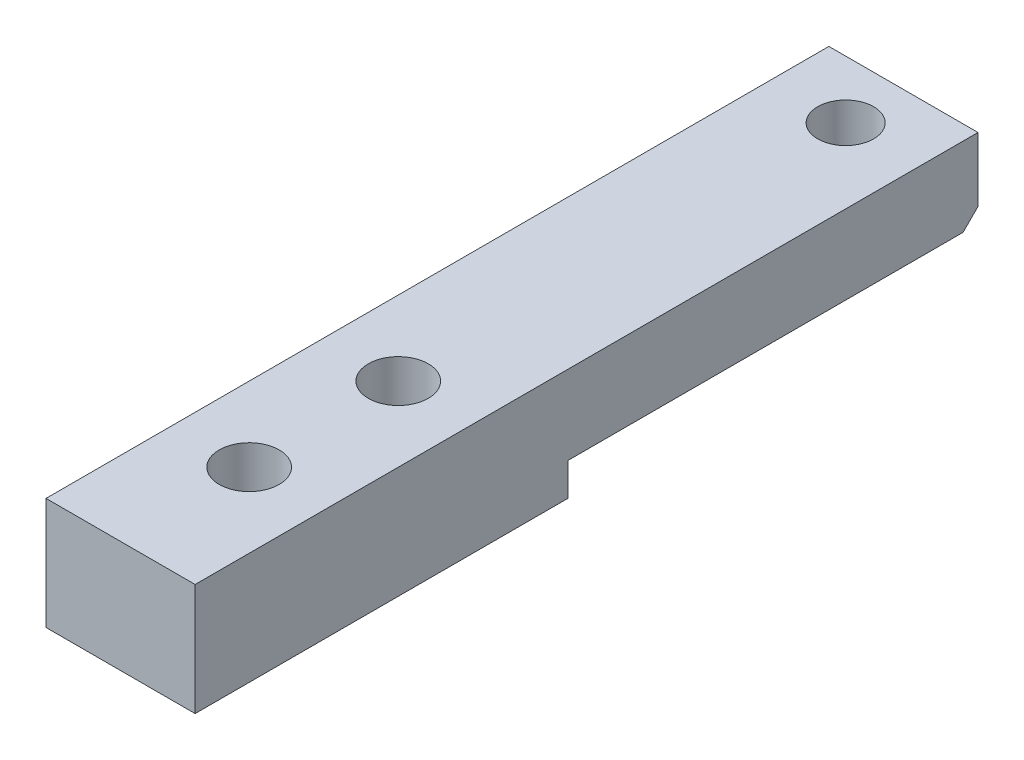
ISO-10303-21;
HEADER;
FILE_DESCRIPTION(('STEP AP214'),'2;1');
FILE_NAME('part.step','',(''),(''),'','','');
FILE_SCHEMA(('AUTOMOTIVE_DESIGN { 1 0 10303 214 1 1 1 1 }'));
ENDSEC;
DATA;
#1=APPLICATION_CONTEXT('core data for automotive mechanical design processes');
#2=APPLICATION_PROTOCOL_DEFINITION('international standard','automotive_design',2000,#1);
#3=PRODUCT_CONTEXT('',#1,'mechanical');
#4=PRODUCT('Part','Part','',(#3));
#5=PRODUCT_RELATED_PRODUCT_CATEGORY('part','',(#4));
#6=PRODUCT_DEFINITION_FORMATION('','',#4);
#7=PRODUCT_DEFINITION_CONTEXT('part definition',#1,'design');
#8=PRODUCT_DEFINITION('design','',#6,#7);
#9=PRODUCT_DEFINITION_SHAPE('','',#8);
#10=(LENGTH_UNIT() NAMED_UNIT(*) SI_UNIT(.MILLI.,.METRE.));
#11=(NAMED_UNIT(*) PLANE_ANGLE_UNIT() SI_UNIT($,.RADIAN.));
#12=(NAMED_UNIT(*) SI_UNIT($,.STERADIAN.) SOLID_ANGLE_UNIT());
#13=UNCERTAINTY_MEASURE_WITH_UNIT(LENGTH_MEASURE(1.E-05),#10,'distance_accuracy_value','');
#14=(GEOMETRIC_REPRESENTATION_CONTEXT(3) GLOBAL_UNCERTAINTY_ASSIGNED_CONTEXT((#13)) GLOBAL_UNIT_ASSIGNED_CONTEXT((#10,
#11,#12)) REPRESENTATION_CONTEXT('',''));
#15=CARTESIAN_POINT('',(0.,0.,0.));
#16=DIRECTION('',(0.,0.,1.));
#17=DIRECTION('',(1.,0.,0.));
#18=AXIS2_PLACEMENT_3D('',#15,#16,#17);
#19=CARTESIAN_POINT('',(6.35,0.,0.));
#20=DIRECTION('',(0.,0.,-1.));
#21=DIRECTION('',(-1.,0.,0.));
#22=AXIS2_PLACEMENT_3D('',#19,#20,#21);
#23=PLANE('',#22);
#24=DIRECTION('',(0.,-1.,0.));
#25=VECTOR('',#24,1.);
#26=CARTESIAN_POINT('',(-6.35,0.,0.));
#27=LINE('',#26,#25);
#28=CARTESIAN_POINT('',(-6.35,9.525,0.));
#29=VERTEX_POINT('',#28);
#30=CARTESIAN_POINT('',(-6.35,0.,0.));
#31=VERTEX_POINT('',#30);
#32=EDGE_CURVE('E117',#29,#31,#27,.T.);
#33=ORIENTED_EDGE('',*,*,#32,.T.);
#34=DIRECTION('',(-1.,0.,0.));
#35=VECTOR('',#34,1.);
#36=CARTESIAN_POINT('',(6.35,0.,0.));
#37=LINE('',#36,#35);
#38=CARTESIAN_POINT('',(6.35,0.,0.));
#39=VERTEX_POINT('',#38);
#40=EDGE_CURVE('E98',#39,#31,#37,.T.);
#41=ORIENTED_EDGE('',*,*,#40,.F.);
#42=DIRECTION('',(0.,-1.,0.));
#43=VECTOR('',#42,1.);
#44=CARTESIAN_POINT('',(6.35,0.,0.));
#45=LINE('',#44,#43);
#46=CARTESIAN_POINT('',(6.35,9.525,0.));
#47=VERTEX_POINT('',#46);
#48=EDGE_CURVE('E105',#47,#39,#45,.T.);
#49=ORIENTED_EDGE('',*,*,#48,.F.);
#50=DIRECTION('',(-1.,0.,0.));
#51=VECTOR('',#50,1.);
#52=CARTESIAN_POINT('',(6.35,9.525,0.));
#53=LINE('',#52,#51);
#54=EDGE_CURVE('E131',#47,#29,#53,.T.);
#55=ORIENTED_EDGE('',*,*,#54,.T.);
#56=EDGE_LOOP('',(#33,#41,#49,#55));
#57=FACE_BOUND('',#56,.T.);
#58=ADVANCED_FACE('F35',(#57),#23,.F.);
#59=CARTESIAN_POINT('',(6.35,0.,0.));
#60=DIRECTION('',(0.,1.,0.));
#61=DIRECTION('',(0.,0.,1.));
#62=AXIS2_PLACEMENT_3D('',#59,#60,#61);
#63=PLANE('',#62);
#64=CARTESIAN_POINT('',(0.,0.,-23.65375));
#65=DIRECTION('',(0.,-1.,0.));
#66=DIRECTION('',(0.,0.,-1.));
#67=AXIS2_PLACEMENT_3D('',#64,#65,#66);
#68=CIRCLE('',#67,2.55269999999999);
#69=CARTESIAN_POINT('',(0.,0.,-26.20645));
#70=VERTEX_POINT('',#69);
#71=EDGE_CURVE('E158',#70,#70,#68,.T.);
#72=ORIENTED_EDGE('',*,*,#71,.F.);
#73=EDGE_LOOP('',(#72));
#74=FACE_BOUND('',#73,.T.);
#75=CARTESIAN_POINT('',(0.,0.,-10.95375));
#76=DIRECTION('',(0.,-1.,0.));
#77=DIRECTION('',(0.,0.,-1.));
#78=AXIS2_PLACEMENT_3D('',#75,#76,#77);
#79=CIRCLE('',#78,2.55269999999999);
#80=CARTESIAN_POINT('',(0.,0.,-13.50645));
#81=VERTEX_POINT('',#80);
#82=EDGE_CURVE('E152',#81,#81,#79,.T.);
#83=ORIENTED_EDGE('',*,*,#82,.F.);
#84=EDGE_LOOP('',(#83));
#85=FACE_BOUND('',#84,.T.);
#86=DIRECTION('',(0.,0.,-1.));
#87=VECTOR('',#86,1.);
#88=CARTESIAN_POINT('',(-6.35,0.,0.));
#89=LINE('',#88,#87);
#90=CARTESIAN_POINT('',(-6.35,0.,-31.75));
#91=VERTEX_POINT('',#90);
#92=EDGE_CURVE('E140',#31,#91,#89,.T.);
#93=ORIENTED_EDGE('',*,*,#92,.T.);
#94=DIRECTION('',(-1.,0.,0.));
#95=VECTOR('',#94,1.);
#96=CARTESIAN_POINT('',(6.35,0.,-31.75));
#97=LINE('',#96,#95);
#98=CARTESIAN_POINT('',(6.35,0.,-31.75));
#99=VERTEX_POINT('',#98);
#100=EDGE_CURVE('E101',#99,#91,#97,.T.);
#101=ORIENTED_EDGE('',*,*,#100,.F.);
#102=DIRECTION('',(0.,0.,-1.));
#103=VECTOR('',#102,1.);
#104=CARTESIAN_POINT('',(6.35,0.,0.));
#105=LINE('',#104,#103);
#106=EDGE_CURVE('E94',#39,#99,#105,.T.);
#107=ORIENTED_EDGE('',*,*,#106,.F.);
#108=ORIENTED_EDGE('',*,*,#40,.T.);
#109=EDGE_LOOP('',(#93,#101,#107,#108));
#110=FACE_BOUND('',#109,.T.);
#111=ADVANCED_FACE('F96',(#74,#85,#110),#63,.F.);
#112=CARTESIAN_POINT('',(6.35,0.,-31.75));
#113=DIRECTION('',(0.,0.,1.));
#114=DIRECTION('',(1.,0.,0.));
#115=AXIS2_PLACEMENT_3D('',#112,#113,#114);
#116=PLANE('',#115);
#117=DIRECTION('',(0.,1.,0.));
#118=VECTOR('',#117,1.);
#119=CARTESIAN_POINT('',(-6.35,0.,-31.75));
#120=LINE('',#119,#118);
#121=CARTESIAN_POINT('',(-6.35,2.794,-31.75));
#122=VERTEX_POINT('',#121);
#123=EDGE_CURVE('E138',#91,#122,#120,.T.);
#124=ORIENTED_EDGE('',*,*,#123,.T.);
#125=DIRECTION('',(-1.,0.,0.));
#126=VECTOR('',#125,1.);
#127=CARTESIAN_POINT('',(6.35,2.794,-31.75));
#128=LINE('',#127,#126);
#129=CARTESIAN_POINT('',(6.35,2.794,-31.75));
#130=VERTEX_POINT('',#129);
#131=EDGE_CURVE('E122',#130,#122,#128,.T.);
#132=ORIENTED_EDGE('',*,*,#131,.F.);
#133=DIRECTION('',(0.,1.,0.));
#134=VECTOR('',#133,1.);
#135=CARTESIAN_POINT('',(6.35,0.,-31.75));
#136=LINE('',#135,#134);
#137=EDGE_CURVE('E104',#99,#130,#136,.T.);
#138=ORIENTED_EDGE('',*,*,#137,.F.);
#139=ORIENTED_EDGE('',*,*,#100,.T.);
#140=EDGE_LOOP('',(#124,#132,#138,#139));
#141=FACE_BOUND('',#140,.T.);
#142=ADVANCED_FACE('F185',(#141),#116,.F.);
#143=CARTESIAN_POINT('',(6.35,2.794,-31.75));
#144=DIRECTION('',(0.,1.,0.));
#145=DIRECTION('',(0.,0.,1.));
#146=AXIS2_PLACEMENT_3D('',#143,#144,#145);
#147=PLANE('',#146);
#148=CARTESIAN_POINT('',(0.,2.794,-61.75375));
#149=DIRECTION('',(0.,1.,0.));
#150=DIRECTION('',(0.,0.,1.));
#151=AXIS2_PLACEMENT_3D('',#148,#149,#150);
#152=CIRCLE('',#151,2.38125);
#153=CARTESIAN_POINT('',(0.,2.794,-59.3725));
#154=VERTEX_POINT('',#153);
#155=EDGE_CURVE('E161',#154,#154,#152,.F.);
#156=ORIENTED_EDGE('',*,*,#155,.F.);
#157=EDGE_LOOP('',(#156));
#158=FACE_BOUND('',#157,.T.);
#159=DIRECTION('',(0.,0.,-1.));
#160=VECTOR('',#159,1.);
#161=CARTESIAN_POINT('',(-6.35,2.794,-31.75));
#162=LINE('',#161,#160);
#163=CARTESIAN_POINT('',(-6.35,2.794,-65.405));
#164=VERTEX_POINT('',#163);
#165=EDGE_CURVE('E136',#122,#164,#162,.T.);
#166=ORIENTED_EDGE('',*,*,#165,.T.);
#167=DIRECTION('',(1.,0.,0.));
#168=VECTOR('',#167,1.);
#169=CARTESIAN_POINT('',(6.35,2.794,-65.405));
#170=LINE('',#169,#168);
#171=CARTESIAN_POINT('',(6.35,2.794,-65.405));
#172=VERTEX_POINT('',#171);
#173=EDGE_CURVE('E43',#164,#172,#170,.T.);
#174=ORIENTED_EDGE('',*,*,#173,.T.);
#175=DIRECTION('',(0.,0.,-1.));
#176=VECTOR('',#175,1.);
#177=CARTESIAN_POINT('',(6.35,2.794,-31.75));
#178=LINE('',#177,#176);
#179=EDGE_CURVE('E147',#130,#172,#178,.T.);
#180=ORIENTED_EDGE('',*,*,#179,.F.);
#181=ORIENTED_EDGE('',*,*,#131,.T.);
#182=EDGE_LOOP('',(#166,#174,#180,#181));
#183=FACE_BOUND('',#182,.T.);
#184=ADVANCED_FACE('F193',(#158,#183),#147,.F.);
#185=CARTESIAN_POINT('',(6.35,9.525,-66.675));
#186=DIRECTION('',(0.,0.,1.));
#187=DIRECTION('',(1.,0.,0.));
#188=AXIS2_PLACEMENT_3D('',#185,#186,#187);
#189=PLANE('',#188);
#190=DIRECTION('',(0.,1.,0.));
#191=VECTOR('',#190,1.);
#192=CARTESIAN_POINT('',(6.35,9.525,-66.675));
#193=LINE('',#192,#191);
#194=CARTESIAN_POINT('',(6.35,4.06400000000001,-66.675));
#195=VERTEX_POINT('',#194);
#196=CARTESIAN_POINT('',(6.35,9.525,-66.675));
#197=VERTEX_POINT('',#196);
#198=EDGE_CURVE('E145',#195,#197,#193,.T.);
#199=ORIENTED_EDGE('',*,*,#198,.F.);
#200=DIRECTION('',(-1.,0.,0.));
#201=VECTOR('',#200,1.);
#202=CARTESIAN_POINT('',(6.35,4.06400000000001,-66.675));
#203=LINE('',#202,#201);
#204=CARTESIAN_POINT('',(-6.35,4.06400000000001,-66.675));
#205=VERTEX_POINT('',#204);
#206=EDGE_CURVE('E118',#195,#205,#203,.T.);
#207=ORIENTED_EDGE('',*,*,#206,.T.);
#208=DIRECTION('',(0.,1.,0.));
#209=VECTOR('',#208,1.);
#210=CARTESIAN_POINT('',(-6.35,9.525,-66.675));
#211=LINE('',#210,#209);
#212=CARTESIAN_POINT('',(-6.35,9.525,-66.675));
#213=VERTEX_POINT('',#212);
#214=EDGE_CURVE('E134',#205,#213,#211,.T.);
#215=ORIENTED_EDGE('',*,*,#214,.T.);
#216=DIRECTION('',(-1.,0.,0.));
#217=VECTOR('',#216,1.);
#218=CARTESIAN_POINT('',(6.35,9.525,-66.675));
#219=LINE('',#218,#217);
#220=EDGE_CURVE('E128',#197,#213,#219,.T.);
#221=ORIENTED_EDGE('',*,*,#220,.F.);
#222=EDGE_LOOP('',(#199,#207,#215,#221));
#223=FACE_BOUND('',#222,.T.);
#224=ADVANCED_FACE('F174',(#223),#189,.F.);
#225=CARTESIAN_POINT('',(6.35,9.525,0.));
#226=DIRECTION('',(0.,-1.,0.));
#227=DIRECTION('',(0.,0.,-1.));
#228=AXIS2_PLACEMENT_3D('',#225,#226,#227);
#229=PLANE('',#228);
#230=CARTESIAN_POINT('',(0.,9.525,-61.75375));
#231=DIRECTION('',(0.,1.,0.));
#232=DIRECTION('',(0.,0.,1.));
#233=AXIS2_PLACEMENT_3D('',#230,#231,#232);
#234=CIRCLE('',#233,2.38125);
#235=CARTESIAN_POINT('',(0.,9.525,-59.3725));
#236=VERTEX_POINT('',#235);
#237=EDGE_CURVE('E164',#236,#236,#234,.T.);
#238=ORIENTED_EDGE('',*,*,#237,.F.);
#239=EDGE_LOOP('',(#238));
#240=FACE_BOUND('',#239,.T.);
#241=CARTESIAN_POINT('',(0.,9.525,-23.65375));
#242=DIRECTION('',(0.,-1.,0.));
#243=DIRECTION('',(0.,0.,-1.));
#244=AXIS2_PLACEMENT_3D('',#241,#242,#243);
#245=CIRCLE('',#244,2.5527);
#246=CARTESIAN_POINT('',(0.,9.525,-26.20645));
#247=VERTEX_POINT('',#246);
#248=EDGE_CURVE('E155',#247,#247,#245,.T.);
#249=ORIENTED_EDGE('',*,*,#248,.T.);
#250=EDGE_LOOP('',(#249));
#251=FACE_BOUND('',#250,.T.);
#252=CARTESIAN_POINT('',(0.,9.525,-10.95375));
#253=DIRECTION('',(0.,-1.,0.));
#254=DIRECTION('',(0.,0.,-1.));
#255=AXIS2_PLACEMENT_3D('',#252,#253,#254);
#256=CIRCLE('',#255,2.5527);
#257=CARTESIAN_POINT('',(0.,9.525,-13.50645));
#258=VERTEX_POINT('',#257);
#259=EDGE_CURVE('E143',#258,#258,#256,.T.);
#260=ORIENTED_EDGE('',*,*,#259,.T.);
#261=EDGE_LOOP('',(#260));
#262=FACE_BOUND('',#261,.T.);
#263=DIRECTION('',(0.,0.,1.));
#264=VECTOR('',#263,1.);
#265=CARTESIAN_POINT('',(-6.35,9.525,0.));
#266=LINE('',#265,#264);
#267=EDGE_CURVE('E114',#213,#29,#266,.T.);
#268=ORIENTED_EDGE('',*,*,#267,.T.);
#269=ORIENTED_EDGE('',*,*,#54,.F.);
#270=DIRECTION('',(0.,0.,1.));
#271=VECTOR('',#270,1.);
#272=CARTESIAN_POINT('',(6.35,9.525,0.));
#273=LINE('',#272,#271);
#274=EDGE_CURVE('E110',#197,#47,#273,.T.);
#275=ORIENTED_EDGE('',*,*,#274,.F.);
#276=ORIENTED_EDGE('',*,*,#220,.T.);
#277=EDGE_LOOP('',(#268,#269,#275,#276));
#278=FACE_BOUND('',#277,.T.);
#279=ADVANCED_FACE('F171',(#240,#251,#262,#278),#229,.F.);
#280=CARTESIAN_POINT('',(6.35,0.,0.));
#281=DIRECTION('',(-1.,0.,0.));
#282=DIRECTION('',(0.,0.,1.));
#283=AXIS2_PLACEMENT_3D('',#280,#281,#282);
#284=PLANE('',#283);
#285=ORIENTED_EDGE('',*,*,#179,.T.);
#286=DIRECTION('',(0.,-0.707106781186547,0.707106781186548));
#287=VECTOR('',#286,1.);
#288=CARTESIAN_POINT('',(6.35,4.06400000000001,-66.675));
#289=LINE('',#288,#287);
#290=EDGE_CURVE('E11',#172,#195,#289,.F.);
#291=ORIENTED_EDGE('',*,*,#290,.T.);
#292=ORIENTED_EDGE('',*,*,#198,.T.);
#293=ORIENTED_EDGE('',*,*,#274,.T.);
#294=ORIENTED_EDGE('',*,*,#48,.T.);
#295=ORIENTED_EDGE('',*,*,#106,.T.);
#296=ORIENTED_EDGE('',*,*,#137,.T.);
#297=EDGE_LOOP('',(#285,#291,#292,#293,#294,#295,#296));
#298=FACE_BOUND('',#297,.T.);
#299=ADVANCED_FACE('F108',(#298),#284,.F.);
#300=CARTESIAN_POINT('',(-6.35,0.,0.));
#301=DIRECTION('',(-1.,0.,0.));
#302=DIRECTION('',(0.,0.,1.));
#303=AXIS2_PLACEMENT_3D('',#300,#301,#302);
#304=PLANE('',#303);
#305=ORIENTED_EDGE('',*,*,#214,.F.);
#306=DIRECTION('',(0.,0.707106781186547,-0.707106781186548));
#307=VECTOR('',#306,1.);
#308=CARTESIAN_POINT('',(-6.35,-31.3055,-31.3055));
#309=LINE('',#308,#307);
#310=EDGE_CURVE('E57',#205,#164,#309,.F.);
#311=ORIENTED_EDGE('',*,*,#310,.T.);
#312=ORIENTED_EDGE('',*,*,#165,.F.);
#313=ORIENTED_EDGE('',*,*,#123,.F.);
#314=ORIENTED_EDGE('',*,*,#92,.F.);
#315=ORIENTED_EDGE('',*,*,#32,.F.);
#316=ORIENTED_EDGE('',*,*,#267,.F.);
#317=EDGE_LOOP('',(#305,#311,#312,#313,#314,#315,#316));
#318=FACE_BOUND('',#317,.T.);
#319=ADVANCED_FACE('F182',(#318),#304,.T.);
#320=CARTESIAN_POINT('',(0.,0.,-10.95375));
#321=DIRECTION('',(0.,-1.,0.));
#322=DIRECTION('',(0.,0.,-1.));
#323=AXIS2_PLACEMENT_3D('',#320,#321,#322);
#324=CYLINDRICAL_SURFACE('',#323,2.55269999999999);
#325=ORIENTED_EDGE('',*,*,#259,.F.);
#326=EDGE_LOOP('',(#325));
#327=FACE_BOUND('',#326,.T.);
#328=ORIENTED_EDGE('',*,*,#82,.T.);
#329=EDGE_LOOP('',(#328));
#330=FACE_BOUND('',#329,.T.);
#331=ADVANCED_FACE('F243',(#327,#330),#324,.F.);
#332=CARTESIAN_POINT('',(0.,0.,-23.65375));
#333=DIRECTION('',(0.,-1.,0.));
#334=DIRECTION('',(0.,0.,-1.));
#335=AXIS2_PLACEMENT_3D('',#332,#333,#334);
#336=CYLINDRICAL_SURFACE('',#335,2.55269999999999);
#337=ORIENTED_EDGE('',*,*,#248,.F.);
#338=EDGE_LOOP('',(#337));
#339=FACE_BOUND('',#338,.T.);
#340=ORIENTED_EDGE('',*,*,#71,.T.);
#341=EDGE_LOOP('',(#340));
#342=FACE_BOUND('',#341,.T.);
#343=ADVANCED_FACE('F258',(#339,#342),#336,.F.);
#344=CARTESIAN_POINT('',(0.,-0.000999999999999265,-61.75375));
#345=DIRECTION('',(0.,1.,0.));
#346=DIRECTION('',(0.,0.,1.));
#347=AXIS2_PLACEMENT_3D('',#344,#345,#346);
#348=CYLINDRICAL_SURFACE('',#347,2.38125);
#349=ORIENTED_EDGE('',*,*,#237,.T.);
#350=EDGE_LOOP('',(#349));
#351=FACE_BOUND('',#350,.T.);
#352=ORIENTED_EDGE('',*,*,#155,.T.);
#353=EDGE_LOOP('',(#352));
#354=FACE_BOUND('',#353,.T.);
#355=ADVANCED_FACE('F168',(#351,#354),#348,.F.);
#356=CARTESIAN_POINT('',(6.35,4.06400000000001,-66.675));
#357=DIRECTION('',(0.,0.707106781186548,0.707106781186547));
#358=DIRECTION('',(-1.,0.,0.));
#359=AXIS2_PLACEMENT_3D('',#356,#357,#358);
#360=PLANE('',#359);
#361=ORIENTED_EDGE('',*,*,#290,.F.);
#362=ORIENTED_EDGE('',*,*,#173,.F.);
#363=ORIENTED_EDGE('',*,*,#310,.F.);
#364=ORIENTED_EDGE('',*,*,#206,.F.);
#365=EDGE_LOOP('',(#361,#362,#363,#364));
#366=FACE_BOUND('',#365,.T.);
#367=ADVANCED_FACE('F37',(#366),#360,.F.);
#368=CLOSED_SHELL('',(#58,#111,#142,#184,#224,#279,#299,#319,#331,#343,#355,#367));
#369=MANIFOLD_SOLID_BREP('B2',#368);
#370=ADVANCED_BREP_SHAPE_REPRESENTATION('',(#18,#369),#14);
#371=SHAPE_DEFINITION_REPRESENTATION(#9,#370);
ENDSEC;
END-ISO-10303-21;
